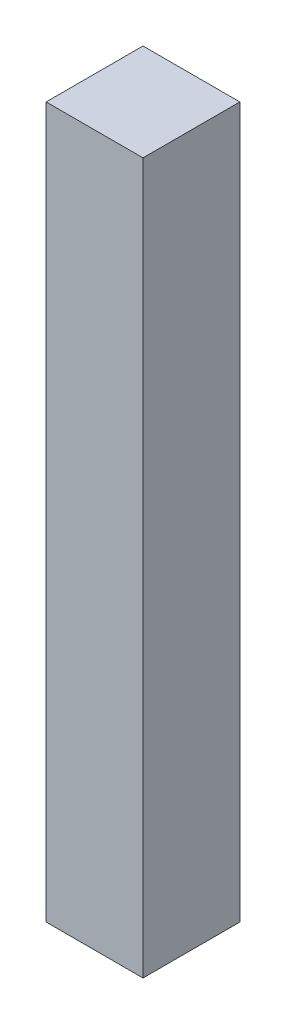
ISO-10303-21;
HEADER;
FILE_DESCRIPTION(('STEP AP214'),'2;1');
FILE_NAME('part.step','',(''),(''),'','','');
FILE_SCHEMA(('AUTOMOTIVE_DESIGN { 1 0 10303 214 1 1 1 1 }'));
ENDSEC;
DATA;
#1=APPLICATION_CONTEXT('core data for automotive mechanical design processes');
#2=APPLICATION_PROTOCOL_DEFINITION('international standard','automotive_design',2000,#1);
#3=PRODUCT_CONTEXT('',#1,'mechanical');
#4=PRODUCT('Part','Part','',(#3));
#5=PRODUCT_RELATED_PRODUCT_CATEGORY('part','',(#4));
#6=PRODUCT_DEFINITION_FORMATION('','',#4);
#7=PRODUCT_DEFINITION_CONTEXT('part definition',#1,'design');
#8=PRODUCT_DEFINITION('design','',#6,#7);
#9=PRODUCT_DEFINITION_SHAPE('','',#8);
#10=(LENGTH_UNIT() NAMED_UNIT(*) SI_UNIT(.MILLI.,.METRE.));
#11=(NAMED_UNIT(*) PLANE_ANGLE_UNIT() SI_UNIT($,.RADIAN.));
#12=(NAMED_UNIT(*) SI_UNIT($,.STERADIAN.) SOLID_ANGLE_UNIT());
#13=UNCERTAINTY_MEASURE_WITH_UNIT(LENGTH_MEASURE(1.E-05),#10,'distance_accuracy_value','');
#14=(GEOMETRIC_REPRESENTATION_CONTEXT(3) GLOBAL_UNCERTAINTY_ASSIGNED_CONTEXT((#13)) GLOBAL_UNIT_ASSIGNED_CONTEXT((#10,
#11,#12)) REPRESENTATION_CONTEXT('',''));
#15=CARTESIAN_POINT('',(0.,0.,0.));
#16=DIRECTION('',(0.,0.,1.));
#17=DIRECTION('',(1.,0.,0.));
#18=AXIS2_PLACEMENT_3D('',#15,#16,#17);
#19=CARTESIAN_POINT('',(0.,110.,0.));
#20=DIRECTION('',(1.,0.,0.));
#21=DIRECTION('',(0.,0.,-1.));
#22=AXIS2_PLACEMENT_3D('',#19,#20,#21);
#23=PLANE('',#22);
#24=DIRECTION('',(0.,0.,1.));
#25=VECTOR('',#24,1.);
#26=CARTESIAN_POINT('',(0.,0.,0.));
#27=LINE('',#26,#25);
#28=CARTESIAN_POINT('',(0.,0.,-15.));
#29=VERTEX_POINT('',#28);
#30=CARTESIAN_POINT('',(0.,0.,0.));
#31=VERTEX_POINT('',#30);
#32=EDGE_CURVE('E102',#29,#31,#27,.T.);
#33=ORIENTED_EDGE('',*,*,#32,.T.);
#34=DIRECTION('',(0.,-1.,0.));
#35=VECTOR('',#34,1.);
#36=CARTESIAN_POINT('',(0.,110.,0.));
#37=LINE('',#36,#35);
#38=CARTESIAN_POINT('',(0.,110.,0.));
#39=VERTEX_POINT('',#38);
#40=EDGE_CURVE('E11',#39,#31,#37,.T.);
#41=ORIENTED_EDGE('',*,*,#40,.F.);
#42=DIRECTION('',(0.,0.,1.));
#43=VECTOR('',#42,1.);
#44=CARTESIAN_POINT('',(0.,110.,0.));
#45=LINE('',#44,#43);
#46=CARTESIAN_POINT('',(0.,110.,-15.));
#47=VERTEX_POINT('',#46);
#48=EDGE_CURVE('E90',#47,#39,#45,.T.);
#49=ORIENTED_EDGE('',*,*,#48,.F.);
#50=DIRECTION('',(0.,-1.,0.));
#51=VECTOR('',#50,1.);
#52=CARTESIAN_POINT('',(0.,110.,-15.));
#53=LINE('',#52,#51);
#54=EDGE_CURVE('E98',#47,#29,#53,.T.);
#55=ORIENTED_EDGE('',*,*,#54,.T.);
#56=EDGE_LOOP('',(#33,#41,#49,#55));
#57=FACE_BOUND('',#56,.T.);
#58=ADVANCED_FACE('F39',(#57),#23,.F.);
#59=CARTESIAN_POINT('',(0.,110.,0.));
#60=DIRECTION('',(0.,0.,-1.));
#61=DIRECTION('',(-1.,0.,0.));
#62=AXIS2_PLACEMENT_3D('',#59,#60,#61);
#63=PLANE('',#62);
#64=DIRECTION('',(1.,0.,0.));
#65=VECTOR('',#64,1.);
#66=CARTESIAN_POINT('',(0.,0.,0.));
#67=LINE('',#66,#65);
#68=CARTESIAN_POINT('',(15.,0.,0.));
#69=VERTEX_POINT('',#68);
#70=EDGE_CURVE('E94',#31,#69,#67,.T.);
#71=ORIENTED_EDGE('',*,*,#70,.T.);
#72=DIRECTION('',(0.,-1.,0.));
#73=VECTOR('',#72,1.);
#74=CARTESIAN_POINT('',(15.,110.,0.));
#75=LINE('',#74,#73);
#76=CARTESIAN_POINT('',(15.,110.,0.));
#77=VERTEX_POINT('',#76);
#78=EDGE_CURVE('E47',#77,#69,#75,.T.);
#79=ORIENTED_EDGE('',*,*,#78,.F.);
#80=DIRECTION('',(1.,0.,0.));
#81=VECTOR('',#80,1.);
#82=CARTESIAN_POINT('',(0.,110.,0.));
#83=LINE('',#82,#81);
#84=EDGE_CURVE('E85',#39,#77,#83,.T.);
#85=ORIENTED_EDGE('',*,*,#84,.F.);
#86=ORIENTED_EDGE('',*,*,#40,.T.);
#87=EDGE_LOOP('',(#71,#79,#85,#86));
#88=FACE_BOUND('',#87,.T.);
#89=ADVANCED_FACE('F93',(#88),#63,.F.);
#90=CARTESIAN_POINT('',(15.,110.,0.));
#91=DIRECTION('',(-1.,0.,0.));
#92=DIRECTION('',(0.,0.,1.));
#93=AXIS2_PLACEMENT_3D('',#90,#91,#92);
#94=PLANE('',#93);
#95=DIRECTION('',(0.,0.,-1.));
#96=VECTOR('',#95,1.);
#97=CARTESIAN_POINT('',(15.,0.,0.));
#98=LINE('',#97,#96);
#99=CARTESIAN_POINT('',(15.,0.,-15.));
#100=VERTEX_POINT('',#99);
#101=EDGE_CURVE('E72',#69,#100,#98,.T.);
#102=ORIENTED_EDGE('',*,*,#101,.T.);
#103=DIRECTION('',(0.,-1.,0.));
#104=VECTOR('',#103,1.);
#105=CARTESIAN_POINT('',(15.,110.,-15.));
#106=LINE('',#105,#104);
#107=CARTESIAN_POINT('',(15.,110.,-15.));
#108=VERTEX_POINT('',#107);
#109=EDGE_CURVE('E95',#108,#100,#106,.T.);
#110=ORIENTED_EDGE('',*,*,#109,.F.);
#111=DIRECTION('',(0.,0.,-1.));
#112=VECTOR('',#111,1.);
#113=CARTESIAN_POINT('',(15.,110.,0.));
#114=LINE('',#113,#112);
#115=EDGE_CURVE('E88',#77,#108,#114,.T.);
#116=ORIENTED_EDGE('',*,*,#115,.F.);
#117=ORIENTED_EDGE('',*,*,#78,.T.);
#118=EDGE_LOOP('',(#102,#110,#116,#117));
#119=FACE_BOUND('',#118,.T.);
#120=ADVANCED_FACE('F96',(#119),#94,.F.);
#121=CARTESIAN_POINT('',(0.,110.,-15.));
#122=DIRECTION('',(0.,0.,1.));
#123=DIRECTION('',(1.,0.,0.));
#124=AXIS2_PLACEMENT_3D('',#121,#122,#123);
#125=PLANE('',#124);
#126=DIRECTION('',(-1.,0.,0.));
#127=VECTOR('',#126,1.);
#128=CARTESIAN_POINT('',(0.,0.,-15.));
#129=LINE('',#128,#127);
#130=EDGE_CURVE('E78',#100,#29,#129,.T.);
#131=ORIENTED_EDGE('',*,*,#130,.T.);
#132=ORIENTED_EDGE('',*,*,#54,.F.);
#133=DIRECTION('',(-1.,0.,0.));
#134=VECTOR('',#133,1.);
#135=CARTESIAN_POINT('',(0.,110.,-15.));
#136=LINE('',#135,#134);
#137=EDGE_CURVE('E55',#108,#47,#136,.T.);
#138=ORIENTED_EDGE('',*,*,#137,.F.);
#139=ORIENTED_EDGE('',*,*,#109,.T.);
#140=EDGE_LOOP('',(#131,#132,#138,#139));
#141=FACE_BOUND('',#140,.T.);
#142=ADVANCED_FACE('F109',(#141),#125,.F.);
#143=CARTESIAN_POINT('',(0.,110.,0.));
#144=DIRECTION('',(0.,-1.,0.));
#145=DIRECTION('',(0.,0.,-1.));
#146=AXIS2_PLACEMENT_3D('',#143,#144,#145);
#147=PLANE('',#146);
#148=ORIENTED_EDGE('',*,*,#48,.T.);
#149=ORIENTED_EDGE('',*,*,#84,.T.);
#150=ORIENTED_EDGE('',*,*,#115,.T.);
#151=ORIENTED_EDGE('',*,*,#137,.T.);
#152=EDGE_LOOP('',(#148,#149,#150,#151));
#153=FACE_BOUND('',#152,.T.);
#154=ADVANCED_FACE('F86',(#153),#147,.F.);
#155=CARTESIAN_POINT('',(0.,0.,0.));
#156=DIRECTION('',(0.,-1.,0.));
#157=DIRECTION('',(0.,0.,-1.));
#158=AXIS2_PLACEMENT_3D('',#155,#156,#157);
#159=PLANE('',#158);
#160=ORIENTED_EDGE('',*,*,#32,.F.);
#161=ORIENTED_EDGE('',*,*,#130,.F.);
#162=ORIENTED_EDGE('',*,*,#101,.F.);
#163=ORIENTED_EDGE('',*,*,#70,.F.);
#164=EDGE_LOOP('',(#160,#161,#162,#163));
#165=FACE_BOUND('',#164,.T.);
#166=ADVANCED_FACE('F112',(#165),#159,.T.);
#167=CLOSED_SHELL('',(#58,#89,#120,#142,#154,#166));
#168=MANIFOLD_SOLID_BREP('B2',#167);
#169=ADVANCED_BREP_SHAPE_REPRESENTATION('',(#18,#168),#14);
#170=SHAPE_DEFINITION_REPRESENTATION(#9,#169);
ENDSEC;
END-ISO-10303-21;
